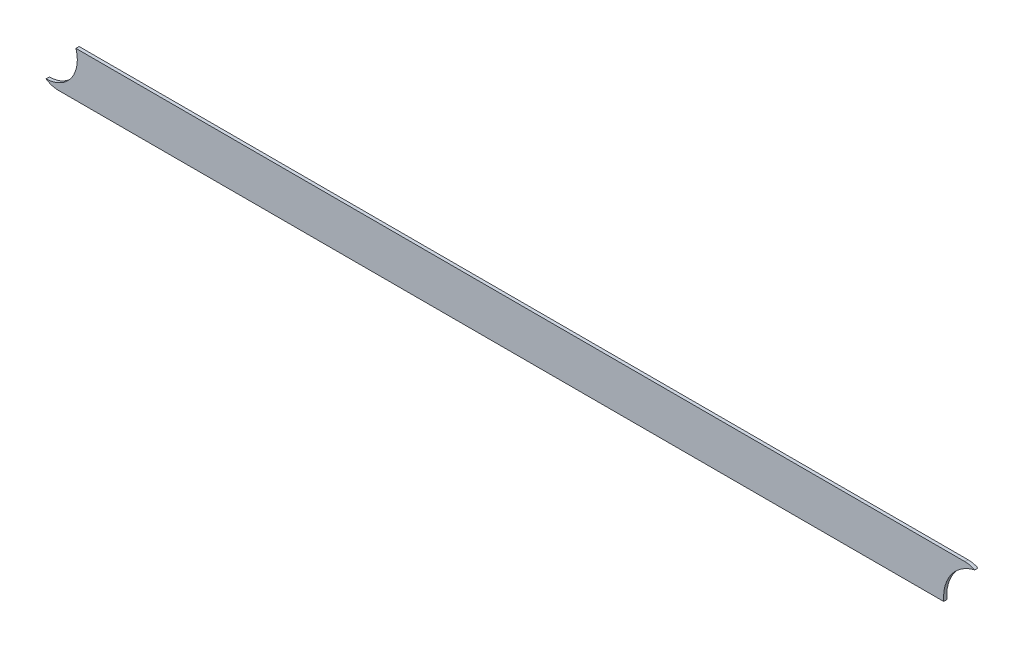
ISO-10303-21;
HEADER;
FILE_DESCRIPTION(('STEP AP214'),'2;1');
FILE_NAME('part.step','',(''),(''),'','','');
FILE_SCHEMA(('AUTOMOTIVE_DESIGN { 1 0 10303 214 1 1 1 1 }'));
ENDSEC;
DATA;
#1=APPLICATION_CONTEXT('core data for automotive mechanical design processes');
#2=APPLICATION_PROTOCOL_DEFINITION('international standard','automotive_design',2000,#1);
#3=PRODUCT_CONTEXT('',#1,'mechanical');
#4=PRODUCT('Part','Part','',(#3));
#5=PRODUCT_RELATED_PRODUCT_CATEGORY('part','',(#4));
#6=PRODUCT_DEFINITION_FORMATION('','',#4);
#7=PRODUCT_DEFINITION_CONTEXT('part definition',#1,'design');
#8=PRODUCT_DEFINITION('design','',#6,#7);
#9=PRODUCT_DEFINITION_SHAPE('','',#8);
#10=(LENGTH_UNIT() NAMED_UNIT(*) SI_UNIT(.MILLI.,.METRE.));
#11=(NAMED_UNIT(*) PLANE_ANGLE_UNIT() SI_UNIT($,.RADIAN.));
#12=(NAMED_UNIT(*) SI_UNIT($,.STERADIAN.) SOLID_ANGLE_UNIT());
#13=UNCERTAINTY_MEASURE_WITH_UNIT(LENGTH_MEASURE(1.E-05),#10,'distance_accuracy_value','');
#14=(GEOMETRIC_REPRESENTATION_CONTEXT(3) GLOBAL_UNCERTAINTY_ASSIGNED_CONTEXT((#13)) GLOBAL_UNIT_ASSIGNED_CONTEXT((#10,
#11,#12)) REPRESENTATION_CONTEXT('',''));
#15=CARTESIAN_POINT('',(0.,0.,0.));
#16=DIRECTION('',(0.,0.,1.));
#17=DIRECTION('',(1.,0.,0.));
#18=AXIS2_PLACEMENT_3D('',#15,#16,#17);
#19=CARTESIAN_POINT('',(107.04733226,84.60266798,0.));
#20=DIRECTION('',(0.,1.,0.));
#21=DIRECTION('',(1.,0.,0.));
#22=AXIS2_PLACEMENT_3D('',#19,#20,#21);
#23=PLANE('',#22);
#24=DIRECTION('',(1.,0.,0.));
#25=VECTOR('',#24,1.);
#26=CARTESIAN_POINT('',(107.04733226,84.60266798,0.03556));
#27=LINE('',#26,#25);
#28=CARTESIAN_POINT('',(107.04733226,84.60266798,0.03556));
#29=VERTEX_POINT('',#28);
#30=CARTESIAN_POINT('',(116.851547242104,84.60266798,0.03556));
#31=VERTEX_POINT('',#30);
#32=EDGE_CURVE('E11',#29,#31,#27,.T.);
#33=ORIENTED_EDGE('',*,*,#32,.F.);
#34=DIRECTION('',(0.,0.,1.));
#35=VECTOR('',#34,1.);
#36=CARTESIAN_POINT('',(107.04733226,84.60266798,0.));
#37=LINE('',#36,#35);
#38=CARTESIAN_POINT('',(107.04733226,84.60266798,0.));
#39=VERTEX_POINT('',#38);
#40=EDGE_CURVE('E24',#39,#29,#37,.T.);
#41=ORIENTED_EDGE('',*,*,#40,.F.);
#42=DIRECTION('',(1.,0.,0.));
#43=VECTOR('',#42,1.);
#44=CARTESIAN_POINT('',(107.04733226,84.60266798,0.));
#45=LINE('',#44,#43);
#46=CARTESIAN_POINT('',(116.851547242104,84.60266798,0.));
#47=VERTEX_POINT('',#46);
#48=EDGE_CURVE('E95',#39,#47,#45,.T.);
#49=ORIENTED_EDGE('',*,*,#48,.T.);
#50=DIRECTION('',(0.,0.,1.));
#51=VECTOR('',#50,1.);
#52=CARTESIAN_POINT('',(116.851547242104,84.60266798,0.));
#53=LINE('',#52,#51);
#54=EDGE_CURVE('E37',#47,#31,#53,.T.);
#55=ORIENTED_EDGE('',*,*,#54,.T.);
#56=EDGE_LOOP('',(#33,#41,#49,#55));
#57=FACE_BOUND('',#56,.T.);
#58=ADVANCED_FACE('F17',(#57),#23,.F.);
#59=CARTESIAN_POINT('',(117.299994,84.6400136,0.));
#60=DIRECTION('',(0.,0.,-1.));
#61=DIRECTION('',(1.,0.,0.));
#62=AXIS2_PLACEMENT_3D('',#59,#60,#61);
#63=CYLINDRICAL_SURFACE('',#62,0.4499991);
#64=DIRECTION('',(0.,0.,1.));
#65=VECTOR('',#64,1.);
#66=CARTESIAN_POINT('',(117.195981446203,85.0778270062056,0.));
#67=LINE('',#66,#65);
#68=CARTESIAN_POINT('',(117.195981446203,85.0778270062056,0.));
#69=VERTEX_POINT('',#68);
#70=CARTESIAN_POINT('',(117.195981446203,85.0778270062056,0.03556));
#71=VERTEX_POINT('',#70);
#72=EDGE_CURVE('E125',#69,#71,#67,.T.);
#73=ORIENTED_EDGE('',*,*,#72,.T.);
#74=CARTESIAN_POINT('',(117.299994,84.6400136,0.03556));
#75=DIRECTION('',(0.,0.,1.));
#76=DIRECTION('',(1.,0.,0.));
#77=AXIS2_PLACEMENT_3D('',#74,#75,#76);
#78=CIRCLE('',#77,0.4499991);
#79=EDGE_CURVE('E122',#71,#31,#78,.T.);
#80=ORIENTED_EDGE('',*,*,#79,.T.);
#81=ORIENTED_EDGE('',*,*,#54,.F.);
#82=CARTESIAN_POINT('',(117.299994,84.6400136,0.));
#83=DIRECTION('',(0.,0.,1.));
#84=DIRECTION('',(1.,0.,0.));
#85=AXIS2_PLACEMENT_3D('',#82,#83,#84);
#86=CIRCLE('',#85,0.4499991);
#87=EDGE_CURVE('E120',#69,#47,#86,.T.);
#88=ORIENTED_EDGE('',*,*,#87,.F.);
#89=EDGE_LOOP('',(#73,#80,#81,#88));
#90=FACE_BOUND('',#89,.T.);
#91=ADVANCED_FACE('F132',(#90),#63,.F.);
#92=CARTESIAN_POINT('',(117.08734012,84.85266748,0.));
#93=DIRECTION('',(0.,0.,-1.));
#94=DIRECTION('',(0.,-1.,0.));
#95=AXIS2_PLACEMENT_3D('',#92,#93,#94);
#96=CYLINDRICAL_SURFACE('',#95,0.249999500000001);
#97=CARTESIAN_POINT('',(117.08734012,84.85266748,0.03556));
#98=DIRECTION('',(0.,0.,1.));
#99=DIRECTION('',(0.,-1.,0.));
#100=AXIS2_PLACEMENT_3D('',#97,#98,#99);
#101=CIRCLE('',#100,0.249999500000001);
#102=CARTESIAN_POINT('',(117.08734012,85.10266698,0.03556));
#103=VERTEX_POINT('',#102);
#104=EDGE_CURVE('E117',#71,#103,#101,.T.);
#105=ORIENTED_EDGE('',*,*,#104,.F.);
#106=ORIENTED_EDGE('',*,*,#72,.F.);
#107=CARTESIAN_POINT('',(117.08734012,84.85266748,0.));
#108=DIRECTION('',(0.,0.,1.));
#109=DIRECTION('',(0.,-1.,0.));
#110=AXIS2_PLACEMENT_3D('',#107,#108,#109);
#111=CIRCLE('',#110,0.249999500000001);
#112=CARTESIAN_POINT('',(117.08734012,85.10266698,0.));
#113=VERTEX_POINT('',#112);
#114=EDGE_CURVE('E114',#69,#113,#111,.T.);
#115=ORIENTED_EDGE('',*,*,#114,.T.);
#116=DIRECTION('',(0.,0.,1.));
#117=VECTOR('',#116,1.);
#118=CARTESIAN_POINT('',(117.08734012,85.10266698,0.));
#119=LINE('',#118,#117);
#120=EDGE_CURVE('E112',#113,#103,#119,.T.);
#121=ORIENTED_EDGE('',*,*,#120,.T.);
#122=EDGE_LOOP('',(#105,#106,#115,#121));
#123=FACE_BOUND('',#122,.T.);
#124=ADVANCED_FACE('F139',(#123),#96,.T.);
#125=CARTESIAN_POINT('',(117.08734012,85.10266698,0.));
#126=DIRECTION('',(0.,-1.,0.));
#127=DIRECTION('',(-1.,0.,0.));
#128=AXIS2_PLACEMENT_3D('',#125,#126,#127);
#129=PLANE('',#128);
#130=DIRECTION('',(-1.,0.,0.));
#131=VECTOR('',#130,1.);
#132=CARTESIAN_POINT('',(117.08734012,85.10266698,0.03556));
#133=LINE('',#132,#131);
#134=CARTESIAN_POINT('',(107.240456441525,85.10266698,0.03556));
#135=VERTEX_POINT('',#134);
#136=EDGE_CURVE('E109',#103,#135,#133,.T.);
#137=ORIENTED_EDGE('',*,*,#136,.F.);
#138=ORIENTED_EDGE('',*,*,#120,.F.);
#139=DIRECTION('',(-1.,0.,0.));
#140=VECTOR('',#139,1.);
#141=CARTESIAN_POINT('',(117.08734012,85.10266698,0.));
#142=LINE('',#141,#140);
#143=CARTESIAN_POINT('',(107.240456441525,85.10266698,0.));
#144=VERTEX_POINT('',#143);
#145=EDGE_CURVE('E106',#113,#144,#142,.T.);
#146=ORIENTED_EDGE('',*,*,#145,.T.);
#147=DIRECTION('',(0.,0.,1.));
#148=VECTOR('',#147,1.);
#149=CARTESIAN_POINT('',(107.240456441525,85.10266698,0.));
#150=LINE('',#149,#148);
#151=EDGE_CURVE('E104',#144,#135,#150,.T.);
#152=ORIENTED_EDGE('',*,*,#151,.T.);
#153=EDGE_LOOP('',(#137,#138,#146,#152));
#154=FACE_BOUND('',#153,.T.);
#155=ADVANCED_FACE('F141',(#154),#129,.F.);
#156=CARTESIAN_POINT('',(106.89999956,85.00000018,0.));
#157=DIRECTION('',(0.,0.,-1.));
#158=DIRECTION('',(1.,0.,0.));
#159=AXIS2_PLACEMENT_3D('',#156,#157,#158);
#160=CYLINDRICAL_SURFACE('',#159,0.3556);
#161=DIRECTION('',(0.,0.,1.));
#162=VECTOR('',#161,1.);
#163=CARTESIAN_POINT('',(107.25559956,85.00000018,0.));
#164=LINE('',#163,#162);
#165=CARTESIAN_POINT('',(107.25559956,85.00000018,0.));
#166=VERTEX_POINT('',#165);
#167=CARTESIAN_POINT('',(107.25559956,85.00000018,0.03556));
#168=VERTEX_POINT('',#167);
#169=EDGE_CURVE('E87',#166,#168,#164,.T.);
#170=ORIENTED_EDGE('',*,*,#169,.T.);
#171=CARTESIAN_POINT('',(106.89999956,85.00000018,0.03556));
#172=DIRECTION('',(0.,0.,1.));
#173=DIRECTION('',(1.,0.,0.));
#174=AXIS2_PLACEMENT_3D('',#171,#172,#173);
#175=CIRCLE('',#174,0.3556);
#176=EDGE_CURVE('E100',#168,#135,#175,.T.);
#177=ORIENTED_EDGE('',*,*,#176,.T.);
#178=ORIENTED_EDGE('',*,*,#151,.F.);
#179=CARTESIAN_POINT('',(106.89999956,85.00000018,0.));
#180=DIRECTION('',(0.,0.,1.));
#181=DIRECTION('',(1.,0.,0.));
#182=AXIS2_PLACEMENT_3D('',#179,#180,#181);
#183=CIRCLE('',#182,0.3556);
#184=EDGE_CURVE('E81',#166,#144,#183,.T.);
#185=ORIENTED_EDGE('',*,*,#184,.F.);
#186=EDGE_LOOP('',(#170,#177,#178,#185));
#187=FACE_BOUND('',#186,.T.);
#188=ADVANCED_FACE('F144',(#187),#160,.F.);
#189=CARTESIAN_POINT('',(106.89999956,85.00000018,0.));
#190=DIRECTION('',(0.,0.,-1.));
#191=DIRECTION('',(1.,0.,0.));
#192=AXIS2_PLACEMENT_3D('',#189,#190,#191);
#193=CYLINDRICAL_SURFACE('',#192,0.3556);
#194=DIRECTION('',(0.,0.,1.));
#195=VECTOR('',#194,1.);
#196=CARTESIAN_POINT('',(106.908874304815,84.6445109411974,0.));
#197=LINE('',#196,#195);
#198=CARTESIAN_POINT('',(106.908874304815,84.6445109411974,0.));
#199=VERTEX_POINT('',#198);
#200=CARTESIAN_POINT('',(106.908874304815,84.6445109411974,0.03556));
#201=VERTEX_POINT('',#200);
#202=EDGE_CURVE('E71',#199,#201,#197,.T.);
#203=ORIENTED_EDGE('',*,*,#202,.T.);
#204=CARTESIAN_POINT('',(106.89999956,85.00000018,0.03556));
#205=DIRECTION('',(0.,0.,1.));
#206=DIRECTION('',(1.,0.,0.));
#207=AXIS2_PLACEMENT_3D('',#204,#205,#206);
#208=CIRCLE('',#207,0.3556);
#209=EDGE_CURVE('E82',#201,#168,#208,.T.);
#210=ORIENTED_EDGE('',*,*,#209,.T.);
#211=ORIENTED_EDGE('',*,*,#169,.F.);
#212=EDGE_CURVE('E85',#199,#166,#183,.T.);
#213=ORIENTED_EDGE('',*,*,#212,.F.);
#214=EDGE_LOOP('',(#203,#210,#211,#213));
#215=FACE_BOUND('',#214,.T.);
#216=ADVANCED_FACE('F86',(#215),#193,.F.);
#217=CARTESIAN_POINT('',(107.04733226,84.85266748,0.));
#218=DIRECTION('',(0.,0.,-1.));
#219=DIRECTION('',(0.,1.,0.));
#220=AXIS2_PLACEMENT_3D('',#217,#218,#219);
#221=CYLINDRICAL_SURFACE('',#220,0.249999500000001);
#222=CARTESIAN_POINT('',(107.04733226,84.85266748,0.03556));
#223=DIRECTION('',(0.,0.,1.));
#224=DIRECTION('',(0.,1.,0.));
#225=AXIS2_PLACEMENT_3D('',#222,#223,#224);
#226=CIRCLE('',#225,0.249999500000001);
#227=EDGE_CURVE('E77',#201,#29,#226,.T.);
#228=ORIENTED_EDGE('',*,*,#227,.F.);
#229=ORIENTED_EDGE('',*,*,#202,.F.);
#230=CARTESIAN_POINT('',(107.04733226,84.85266748,0.));
#231=DIRECTION('',(0.,0.,1.));
#232=DIRECTION('',(0.,1.,0.));
#233=AXIS2_PLACEMENT_3D('',#230,#231,#232);
#234=CIRCLE('',#233,0.249999500000001);
#235=EDGE_CURVE('E75',#199,#39,#234,.T.);
#236=ORIENTED_EDGE('',*,*,#235,.T.);
#237=ORIENTED_EDGE('',*,*,#40,.T.);
#238=EDGE_LOOP('',(#228,#229,#236,#237));
#239=FACE_BOUND('',#238,.T.);
#240=ADVANCED_FACE('F73',(#239),#221,.T.);
#241=CARTESIAN_POINT('',(107.04733226,84.60266798,0.));
#242=DIRECTION('',(0.,0.,-1.));
#243=DIRECTION('',(-1.,0.,0.));
#244=AXIS2_PLACEMENT_3D('',#241,#242,#243);
#245=PLANE('',#244);
#246=ORIENTED_EDGE('',*,*,#48,.F.);
#247=ORIENTED_EDGE('',*,*,#235,.F.);
#248=ORIENTED_EDGE('',*,*,#212,.T.);
#249=ORIENTED_EDGE('',*,*,#184,.T.);
#250=ORIENTED_EDGE('',*,*,#145,.F.);
#251=ORIENTED_EDGE('',*,*,#114,.F.);
#252=ORIENTED_EDGE('',*,*,#87,.T.);
#253=EDGE_LOOP('',(#246,#247,#248,#249,#250,#251,#252));
#254=FACE_BOUND('',#253,.T.);
#255=ADVANCED_FACE('F93',(#254),#245,.T.);
#256=CARTESIAN_POINT('',(107.04733226,84.60266798,0.03556));
#257=DIRECTION('',(0.,0.,-1.));
#258=DIRECTION('',(-1.,0.,0.));
#259=AXIS2_PLACEMENT_3D('',#256,#257,#258);
#260=PLANE('',#259);
#261=ORIENTED_EDGE('',*,*,#227,.T.);
#262=ORIENTED_EDGE('',*,*,#32,.T.);
#263=ORIENTED_EDGE('',*,*,#79,.F.);
#264=ORIENTED_EDGE('',*,*,#104,.T.);
#265=ORIENTED_EDGE('',*,*,#136,.T.);
#266=ORIENTED_EDGE('',*,*,#176,.F.);
#267=ORIENTED_EDGE('',*,*,#209,.F.);
#268=EDGE_LOOP('',(#261,#262,#263,#264,#265,#266,#267));
#269=FACE_BOUND('',#268,.T.);
#270=ADVANCED_FACE('F136',(#269),#260,.F.);
#271=CLOSED_SHELL('',(#58,#91,#124,#155,#188,#216,#240,#255,#270));
#272=MANIFOLD_SOLID_BREP('B1',#271);
#273=ADVANCED_BREP_SHAPE_REPRESENTATION('',(#18,#272),#14);
#274=SHAPE_DEFINITION_REPRESENTATION(#9,#273);
ENDSEC;
END-ISO-10303-21;
